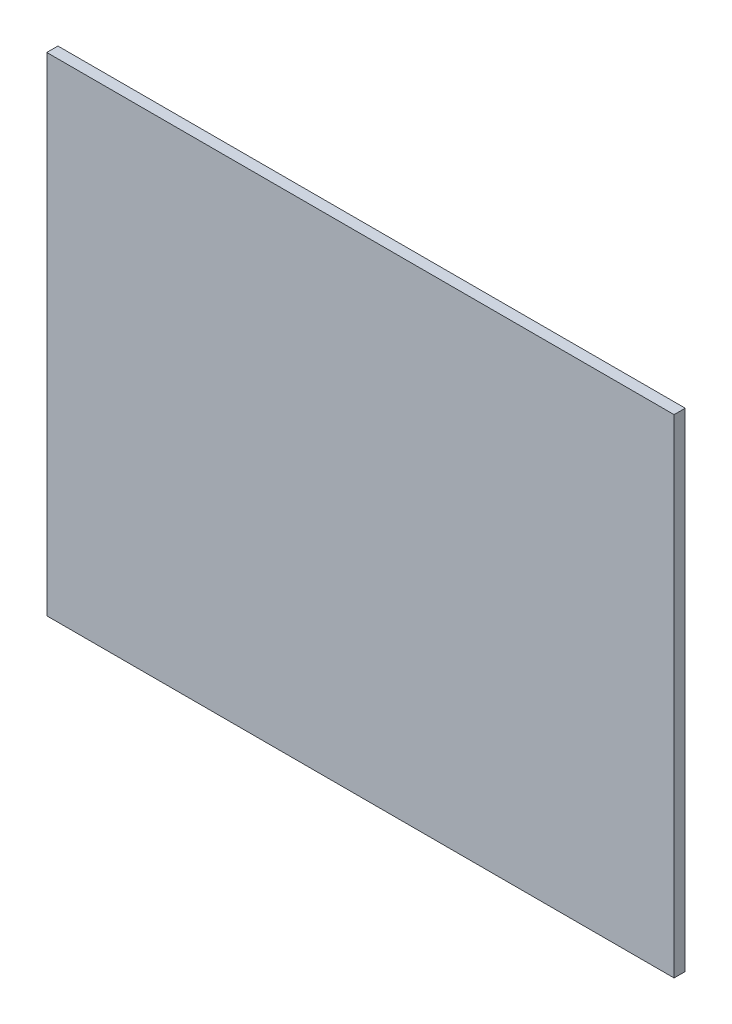
ISO-10303-21;
HEADER;
FILE_DESCRIPTION(('STEP AP214'),'2;1');
FILE_NAME('part.step','',(''),(''),'','','');
FILE_SCHEMA(('AUTOMOTIVE_DESIGN { 1 0 10303 214 1 1 1 1 }'));
ENDSEC;
DATA;
#1=APPLICATION_CONTEXT('core data for automotive mechanical design processes');
#2=APPLICATION_PROTOCOL_DEFINITION('international standard','automotive_design',2000,#1);
#3=PRODUCT_CONTEXT('',#1,'mechanical');
#4=PRODUCT('Part','Part','',(#3));
#5=PRODUCT_RELATED_PRODUCT_CATEGORY('part','',(#4));
#6=PRODUCT_DEFINITION_FORMATION('','',#4);
#7=PRODUCT_DEFINITION_CONTEXT('part definition',#1,'design');
#8=PRODUCT_DEFINITION('design','',#6,#7);
#9=PRODUCT_DEFINITION_SHAPE('','',#8);
#10=(LENGTH_UNIT() NAMED_UNIT(*) SI_UNIT(.MILLI.,.METRE.));
#11=(NAMED_UNIT(*) PLANE_ANGLE_UNIT() SI_UNIT($,.RADIAN.));
#12=(NAMED_UNIT(*) SI_UNIT($,.STERADIAN.) SOLID_ANGLE_UNIT());
#13=UNCERTAINTY_MEASURE_WITH_UNIT(LENGTH_MEASURE(1.E-05),#10,'distance_accuracy_value','');
#14=(GEOMETRIC_REPRESENTATION_CONTEXT(3) GLOBAL_UNCERTAINTY_ASSIGNED_CONTEXT((#13)) GLOBAL_UNIT_ASSIGNED_CONTEXT((#10,
#11,#12)) REPRESENTATION_CONTEXT('',''));
#15=CARTESIAN_POINT('',(0.,0.,0.));
#16=DIRECTION('',(0.,0.,1.));
#17=DIRECTION('',(1.,0.,0.));
#18=AXIS2_PLACEMENT_3D('',#15,#16,#17);
#19=CARTESIAN_POINT('',(22.5000011482218,0.,3.2));
#20=DIRECTION('',(1.,0.,0.));
#21=DIRECTION('',(0.,0.,-1.));
#22=AXIS2_PLACEMENT_3D('',#19,#20,#21);
#23=PLANE('',#22);
#24=DIRECTION('',(0.,-1.,0.));
#25=VECTOR('',#24,1.);
#26=CARTESIAN_POINT('',(22.5000011482218,0.,0.));
#27=LINE('',#26,#25);
#28=CARTESIAN_POINT('',(22.5000011482218,5.00000065388698,0.));
#29=VERTEX_POINT('',#28);
#30=CARTESIAN_POINT('',(22.5000011482218,-135.000001270028,0.));
#31=VERTEX_POINT('',#30);
#32=EDGE_CURVE('E97',#29,#31,#27,.T.);
#33=ORIENTED_EDGE('',*,*,#32,.F.);
#34=DIRECTION('',(0.,0.,-1.));
#35=VECTOR('',#34,1.);
#36=CARTESIAN_POINT('',(22.5000011482218,5.00000065388698,3.2));
#37=LINE('',#36,#35);
#38=CARTESIAN_POINT('',(22.5000011482218,5.00000065388698,3.2));
#39=VERTEX_POINT('',#38);
#40=EDGE_CURVE('E11',#39,#29,#37,.T.);
#41=ORIENTED_EDGE('',*,*,#40,.F.);
#42=DIRECTION('',(0.,-1.,0.));
#43=VECTOR('',#42,1.);
#44=CARTESIAN_POINT('',(22.5000011482218,0.,3.2));
#45=LINE('',#44,#43);
#46=CARTESIAN_POINT('',(22.5000011482218,-135.000001270028,3.2));
#47=VERTEX_POINT('',#46);
#48=EDGE_CURVE('E91',#39,#47,#45,.T.);
#49=ORIENTED_EDGE('',*,*,#48,.T.);
#50=DIRECTION('',(0.,0.,-1.));
#51=VECTOR('',#50,1.);
#52=CARTESIAN_POINT('',(22.5000011482218,-135.000001270028,3.2));
#53=LINE('',#52,#51);
#54=EDGE_CURVE('E72',#47,#31,#53,.T.);
#55=ORIENTED_EDGE('',*,*,#54,.T.);
#56=EDGE_LOOP('',(#33,#41,#49,#55));
#57=FACE_BOUND('',#56,.T.);
#58=ADVANCED_FACE('F34',(#57),#23,.T.);
#59=CARTESIAN_POINT('',(0.,5.00000065388698,3.2));
#60=DIRECTION('',(0.,1.,0.));
#61=DIRECTION('',(0.,0.,1.));
#62=AXIS2_PLACEMENT_3D('',#59,#60,#61);
#63=PLANE('',#62);
#64=DIRECTION('',(1.,0.,0.));
#65=VECTOR('',#64,1.);
#66=CARTESIAN_POINT('',(0.,5.00000065388698,0.));
#67=LINE('',#66,#65);
#68=CARTESIAN_POINT('',(-157.499999170389,5.00000065388698,0.));
#69=VERTEX_POINT('',#68);
#70=EDGE_CURVE('E85',#69,#29,#67,.T.);
#71=ORIENTED_EDGE('',*,*,#70,.F.);
#72=DIRECTION('',(0.,0.,-1.));
#73=VECTOR('',#72,1.);
#74=CARTESIAN_POINT('',(-157.499999170389,5.00000065388698,3.2));
#75=LINE('',#74,#73);
#76=CARTESIAN_POINT('',(-157.499999170389,5.00000065388698,3.2));
#77=VERTEX_POINT('',#76);
#78=EDGE_CURVE('E42',#77,#69,#75,.T.);
#79=ORIENTED_EDGE('',*,*,#78,.F.);
#80=DIRECTION('',(1.,0.,0.));
#81=VECTOR('',#80,1.);
#82=CARTESIAN_POINT('',(0.,5.00000065388698,3.2));
#83=LINE('',#82,#81);
#84=EDGE_CURVE('E83',#77,#39,#83,.T.);
#85=ORIENTED_EDGE('',*,*,#84,.T.);
#86=ORIENTED_EDGE('',*,*,#40,.T.);
#87=EDGE_LOOP('',(#71,#79,#85,#86));
#88=FACE_BOUND('',#87,.T.);
#89=ADVANCED_FACE('F81',(#88),#63,.T.);
#90=CARTESIAN_POINT('',(-157.499999170389,0.,3.2));
#91=DIRECTION('',(1.,0.,0.));
#92=DIRECTION('',(0.,0.,-1.));
#93=AXIS2_PLACEMENT_3D('',#90,#91,#92);
#94=PLANE('',#93);
#95=DIRECTION('',(0.,-1.,0.));
#96=VECTOR('',#95,1.);
#97=CARTESIAN_POINT('',(-157.499999170389,0.,0.));
#98=LINE('',#97,#96);
#99=CARTESIAN_POINT('',(-157.499999170389,-135.000001270028,0.));
#100=VERTEX_POINT('',#99);
#101=EDGE_CURVE('E65',#69,#100,#98,.T.);
#102=ORIENTED_EDGE('',*,*,#101,.T.);
#103=DIRECTION('',(0.,0.,-1.));
#104=VECTOR('',#103,1.);
#105=CARTESIAN_POINT('',(-157.499999170389,-135.000001270028,3.2));
#106=LINE('',#105,#104);
#107=CARTESIAN_POINT('',(-157.499999170389,-135.000001270028,3.2));
#108=VERTEX_POINT('',#107);
#109=EDGE_CURVE('E86',#108,#100,#106,.T.);
#110=ORIENTED_EDGE('',*,*,#109,.F.);
#111=DIRECTION('',(0.,-1.,0.));
#112=VECTOR('',#111,1.);
#113=CARTESIAN_POINT('',(-157.499999170389,0.,3.2));
#114=LINE('',#113,#112);
#115=EDGE_CURVE('E87',#77,#108,#114,.T.);
#116=ORIENTED_EDGE('',*,*,#115,.F.);
#117=ORIENTED_EDGE('',*,*,#78,.T.);
#118=EDGE_LOOP('',(#102,#110,#116,#117));
#119=FACE_BOUND('',#118,.T.);
#120=ADVANCED_FACE('F88',(#119),#94,.F.);
#121=CARTESIAN_POINT('',(0.,-135.000001270028,3.2));
#122=DIRECTION('',(0.,1.,0.));
#123=DIRECTION('',(0.,0.,1.));
#124=AXIS2_PLACEMENT_3D('',#121,#122,#123);
#125=PLANE('',#124);
#126=DIRECTION('',(1.,0.,0.));
#127=VECTOR('',#126,1.);
#128=CARTESIAN_POINT('',(0.,-135.000001270028,0.));
#129=LINE('',#128,#127);
#130=EDGE_CURVE('E93',#100,#31,#129,.T.);
#131=ORIENTED_EDGE('',*,*,#130,.T.);
#132=ORIENTED_EDGE('',*,*,#54,.F.);
#133=DIRECTION('',(1.,0.,0.));
#134=VECTOR('',#133,1.);
#135=CARTESIAN_POINT('',(0.,-135.000001270028,3.2));
#136=LINE('',#135,#134);
#137=EDGE_CURVE('E50',#108,#47,#136,.T.);
#138=ORIENTED_EDGE('',*,*,#137,.F.);
#139=ORIENTED_EDGE('',*,*,#109,.T.);
#140=EDGE_LOOP('',(#131,#132,#138,#139));
#141=FACE_BOUND('',#140,.T.);
#142=ADVANCED_FACE('F106',(#141),#125,.F.);
#143=CARTESIAN_POINT('',(0.,0.,3.2));
#144=DIRECTION('',(0.,0.,1.));
#145=DIRECTION('',(1.,0.,0.));
#146=AXIS2_PLACEMENT_3D('',#143,#144,#145);
#147=PLANE('',#146);
#148=ORIENTED_EDGE('',*,*,#48,.F.);
#149=ORIENTED_EDGE('',*,*,#84,.F.);
#150=ORIENTED_EDGE('',*,*,#115,.T.);
#151=ORIENTED_EDGE('',*,*,#137,.T.);
#152=EDGE_LOOP('',(#148,#149,#150,#151));
#153=FACE_BOUND('',#152,.T.);
#154=ADVANCED_FACE('F90',(#153),#147,.T.);
#155=CARTESIAN_POINT('',(0.,0.,0.));
#156=DIRECTION('',(0.,0.,1.));
#157=DIRECTION('',(1.,0.,0.));
#158=AXIS2_PLACEMENT_3D('',#155,#156,#157);
#159=PLANE('',#158);
#160=ORIENTED_EDGE('',*,*,#32,.T.);
#161=ORIENTED_EDGE('',*,*,#130,.F.);
#162=ORIENTED_EDGE('',*,*,#101,.F.);
#163=ORIENTED_EDGE('',*,*,#70,.T.);
#164=EDGE_LOOP('',(#160,#161,#162,#163));
#165=FACE_BOUND('',#164,.T.);
#166=ADVANCED_FACE('F108',(#165),#159,.F.);
#167=CLOSED_SHELL('',(#58,#89,#120,#142,#154,#166));
#168=MANIFOLD_SOLID_BREP('B2',#167);
#169=ADVANCED_BREP_SHAPE_REPRESENTATION('',(#18,#168),#14);
#170=SHAPE_DEFINITION_REPRESENTATION(#9,#169);
ENDSEC;
END-ISO-10303-21;
